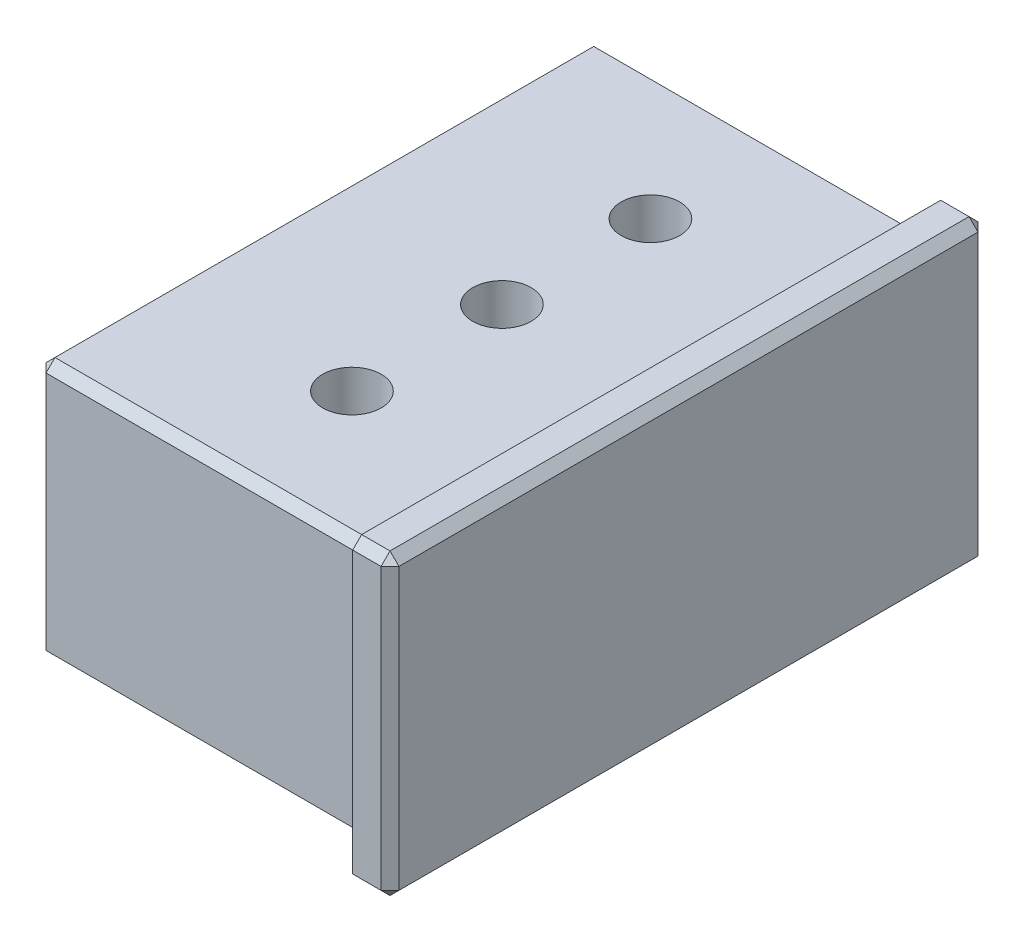
ISO-10303-21;
HEADER;
FILE_DESCRIPTION(('STEP AP214'),'2;1');
FILE_NAME('part.step','',(''),(''),'','','');
FILE_SCHEMA(('AUTOMOTIVE_DESIGN { 1 0 10303 214 1 1 1 1 }'));
ENDSEC;
DATA;
#1=APPLICATION_CONTEXT('core data for automotive mechanical design processes');
#2=APPLICATION_PROTOCOL_DEFINITION('international standard','automotive_design',2000,#1);
#3=PRODUCT_CONTEXT('',#1,'mechanical');
#4=PRODUCT('Part','Part','',(#3));
#5=PRODUCT_RELATED_PRODUCT_CATEGORY('part','',(#4));
#6=PRODUCT_DEFINITION_FORMATION('','',#4);
#7=PRODUCT_DEFINITION_CONTEXT('part definition',#1,'design');
#8=PRODUCT_DEFINITION('design','',#6,#7);
#9=PRODUCT_DEFINITION_SHAPE('','',#8);
#10=(LENGTH_UNIT() NAMED_UNIT(*) SI_UNIT(.MILLI.,.METRE.));
#11=(NAMED_UNIT(*) PLANE_ANGLE_UNIT() SI_UNIT($,.RADIAN.));
#12=(NAMED_UNIT(*) SI_UNIT($,.STERADIAN.) SOLID_ANGLE_UNIT());
#13=UNCERTAINTY_MEASURE_WITH_UNIT(LENGTH_MEASURE(1.E-05),#10,'distance_accuracy_value','');
#14=(GEOMETRIC_REPRESENTATION_CONTEXT(3) GLOBAL_UNCERTAINTY_ASSIGNED_CONTEXT((#13)) GLOBAL_UNIT_ASSIGNED_CONTEXT((#10,
#11,#12)) REPRESENTATION_CONTEXT('',''));
#15=CARTESIAN_POINT('',(0.,0.,0.));
#16=DIRECTION('',(0.,0.,1.));
#17=DIRECTION('',(1.,0.,0.));
#18=AXIS2_PLACEMENT_3D('',#15,#16,#17);
#19=CARTESIAN_POINT('',(28.575,0.,0.));
#20=DIRECTION('',(0.,0.,-1.));
#21=DIRECTION('',(-1.,0.,0.));
#22=AXIS2_PLACEMENT_3D('',#19,#20,#21);
#23=PLANE('',#22);
#24=DIRECTION('',(0.,-1.,0.));
#25=VECTOR('',#24,1.);
#26=CARTESIAN_POINT('',(28.575,0.,0.));
#27=LINE('',#26,#25);
#28=CARTESIAN_POINT('',(28.575,21.209,0.));
#29=VERTEX_POINT('',#28);
#30=CARTESIAN_POINT('',(28.575,0.761999999999998,0.));
#31=VERTEX_POINT('',#30);
#32=EDGE_CURVE('E364',#29,#31,#27,.T.);
#33=ORIENTED_EDGE('',*,*,#32,.F.);
#34=DIRECTION('',(-1.,0.,0.));
#35=VECTOR('',#34,1.);
#36=CARTESIAN_POINT('',(28.575,21.209,0.));
#37=LINE('',#36,#35);
#38=CARTESIAN_POINT('',(0.761999999999999,21.209,0.));
#39=VERTEX_POINT('',#38);
#40=EDGE_CURVE('E59',#29,#39,#37,.T.);
#41=ORIENTED_EDGE('',*,*,#40,.T.);
#42=DIRECTION('',(0.,-1.,0.));
#43=VECTOR('',#42,1.);
#44=CARTESIAN_POINT('',(0.761999999999999,0.,0.));
#45=LINE('',#44,#43);
#46=CARTESIAN_POINT('',(0.761999999999999,0.761999999999999,0.));
#47=VERTEX_POINT('',#46);
#48=EDGE_CURVE('E64',#39,#47,#45,.T.);
#49=ORIENTED_EDGE('',*,*,#48,.T.);
#50=DIRECTION('',(1.,0.,0.));
#51=VECTOR('',#50,1.);
#52=CARTESIAN_POINT('',(28.575,0.761999999999999,0.));
#53=LINE('',#52,#51);
#54=EDGE_CURVE('E279',#47,#31,#53,.T.);
#55=ORIENTED_EDGE('',*,*,#54,.T.);
#56=EDGE_LOOP('',(#33,#41,#49,#55));
#57=FACE_BOUND('',#56,.T.);
#58=ADVANCED_FACE('F41',(#57),#23,.F.);
#59=CARTESIAN_POINT('',(28.575,0.,0.));
#60=DIRECTION('',(0.,1.,0.));
#61=DIRECTION('',(0.,0.,1.));
#62=AXIS2_PLACEMENT_3D('',#59,#60,#61);
#63=PLANE('',#62);
#64=CARTESIAN_POINT('',(15.8750000000001,0.,-10.922));
#65=DIRECTION('',(0.,1.,0.));
#66=DIRECTION('',(0.,0.,1.));
#67=AXIS2_PLACEMENT_3D('',#64,#65,#66);
#68=CIRCLE('',#67,2.4892);
#69=CARTESIAN_POINT('',(15.8750000000001,0.,-8.43280000000003));
#70=VERTEX_POINT('',#69);
#71=EDGE_CURVE('E315',#70,#70,#68,.T.);
#72=ORIENTED_EDGE('',*,*,#71,.T.);
#73=EDGE_LOOP('',(#72));
#74=FACE_BOUND('',#73,.T.);
#75=CARTESIAN_POINT('',(15.8750000000001,0.,-36.322));
#76=DIRECTION('',(0.,1.,0.));
#77=DIRECTION('',(0.,0.,1.));
#78=AXIS2_PLACEMENT_3D('',#75,#76,#77);
#79=CIRCLE('',#78,2.4892);
#80=CARTESIAN_POINT('',(15.8750000000001,0.,-33.8328));
#81=VERTEX_POINT('',#80);
#82=EDGE_CURVE('E648',#81,#81,#79,.T.);
#83=ORIENTED_EDGE('',*,*,#82,.T.);
#84=EDGE_LOOP('',(#83));
#85=FACE_BOUND('',#84,.T.);
#86=CARTESIAN_POINT('',(15.8749999999999,0.,-23.6855000000004));
#87=DIRECTION('',(0.,1.,0.));
#88=DIRECTION('',(0.,0.,1.));
#89=AXIS2_PLACEMENT_3D('',#86,#87,#88);
#90=CIRCLE('',#89,2.4892);
#91=CARTESIAN_POINT('',(15.8749999999999,0.,-21.1963000000004));
#92=VERTEX_POINT('',#91);
#93=EDGE_CURVE('E650',#92,#92,#90,.T.);
#94=ORIENTED_EDGE('',*,*,#93,.T.);
#95=EDGE_LOOP('',(#94));
#96=FACE_BOUND('',#95,.T.);
#97=DIRECTION('',(0.,0.,-1.));
#98=VECTOR('',#97,1.);
#99=CARTESIAN_POINT('',(0.761999999999999,0.,-47.371));
#100=LINE('',#99,#98);
#101=CARTESIAN_POINT('',(0.761999999999999,0.,-0.761999999999999));
#102=VERTEX_POINT('',#101);
#103=CARTESIAN_POINT('',(0.761999999999999,0.,-46.609));
#104=VERTEX_POINT('',#103);
#105=EDGE_CURVE('E253',#102,#104,#100,.T.);
#106=ORIENTED_EDGE('',*,*,#105,.T.);
#107=DIRECTION('',(1.,0.,0.));
#108=VECTOR('',#107,1.);
#109=CARTESIAN_POINT('',(28.575,0.,-46.609));
#110=LINE('',#109,#108);
#111=CARTESIAN_POINT('',(28.575,0.,-46.609));
#112=VERTEX_POINT('',#111);
#113=EDGE_CURVE('E256',#104,#112,#110,.T.);
#114=ORIENTED_EDGE('',*,*,#113,.T.);
#115=DIRECTION('',(0.,0.,-1.));
#116=VECTOR('',#115,1.);
#117=CARTESIAN_POINT('',(28.575,0.,0.));
#118=LINE('',#117,#116);
#119=CARTESIAN_POINT('',(28.575,0.,-0.761999999999999));
#120=VERTEX_POINT('',#119);
#121=EDGE_CURVE('E372',#120,#112,#118,.T.);
#122=ORIENTED_EDGE('',*,*,#121,.F.);
#123=DIRECTION('',(-1.,0.,0.));
#124=VECTOR('',#123,1.);
#125=CARTESIAN_POINT('',(28.575,0.,-0.761999999999999));
#126=LINE('',#125,#124);
#127=EDGE_CURVE('E251',#120,#102,#126,.T.);
#128=ORIENTED_EDGE('',*,*,#127,.T.);
#129=EDGE_LOOP('',(#106,#114,#122,#128));
#130=FACE_BOUND('',#129,.T.);
#131=ADVANCED_FACE('F453',(#74,#85,#96,#130),#63,.F.);
#132=CARTESIAN_POINT('',(28.575,0.,-47.371));
#133=DIRECTION('',(0.,0.,1.));
#134=DIRECTION('',(1.,0.,0.));
#135=AXIS2_PLACEMENT_3D('',#132,#133,#134);
#136=PLANE('',#135);
#137=DIRECTION('',(0.,1.,0.));
#138=VECTOR('',#137,1.);
#139=CARTESIAN_POINT('',(28.575,0.,-47.371));
#140=LINE('',#139,#138);
#141=CARTESIAN_POINT('',(28.575,0.761999999999999,-47.371));
#142=VERTEX_POINT('',#141);
#143=CARTESIAN_POINT('',(28.575,21.209,-47.371));
#144=VERTEX_POINT('',#143);
#145=EDGE_CURVE('E375',#142,#144,#140,.T.);
#146=ORIENTED_EDGE('',*,*,#145,.F.);
#147=DIRECTION('',(-1.,0.,0.));
#148=VECTOR('',#147,1.);
#149=CARTESIAN_POINT('',(28.575,0.761999999999999,-47.371));
#150=LINE('',#149,#148);
#151=CARTESIAN_POINT('',(0.761999999999999,0.761999999999999,-47.371));
#152=VERTEX_POINT('',#151);
#153=EDGE_CURVE('E271',#142,#152,#150,.T.);
#154=ORIENTED_EDGE('',*,*,#153,.T.);
#155=DIRECTION('',(0.,1.,0.));
#156=VECTOR('',#155,1.);
#157=CARTESIAN_POINT('',(0.761999999999999,21.971,-47.371));
#158=LINE('',#157,#156);
#159=CARTESIAN_POINT('',(0.761999999999999,21.209,-47.371));
#160=VERTEX_POINT('',#159);
#161=EDGE_CURVE('E269',#152,#160,#158,.T.);
#162=ORIENTED_EDGE('',*,*,#161,.T.);
#163=DIRECTION('',(1.,0.,0.));
#164=VECTOR('',#163,1.);
#165=CARTESIAN_POINT('',(28.575,21.209,-47.371));
#166=LINE('',#165,#164);
#167=EDGE_CURVE('E267',#160,#144,#166,.T.);
#168=ORIENTED_EDGE('',*,*,#167,.T.);
#169=EDGE_LOOP('',(#146,#154,#162,#168));
#170=FACE_BOUND('',#169,.T.);
#171=ADVANCED_FACE('F458',(#170),#136,.F.);
#172=CARTESIAN_POINT('',(28.575,21.971,0.));
#173=DIRECTION('',(0.,-1.,0.));
#174=DIRECTION('',(0.,0.,-1.));
#175=AXIS2_PLACEMENT_3D('',#172,#173,#174);
#176=PLANE('',#175);
#177=CARTESIAN_POINT('',(15.8750000000001,21.971,-10.922));
#178=DIRECTION('',(0.,1.,0.));
#179=DIRECTION('',(0.,0.,1.));
#180=AXIS2_PLACEMENT_3D('',#177,#178,#179);
#181=CIRCLE('',#180,2.4892);
#182=CARTESIAN_POINT('',(15.8750000000001,21.971,-8.43280000000003));
#183=VERTEX_POINT('',#182);
#184=EDGE_CURVE('E658',#183,#183,#181,.T.);
#185=ORIENTED_EDGE('',*,*,#184,.F.);
#186=EDGE_LOOP('',(#185));
#187=FACE_BOUND('',#186,.T.);
#188=CARTESIAN_POINT('',(15.8750000000001,21.971,-36.322));
#189=DIRECTION('',(0.,1.,0.));
#190=DIRECTION('',(0.,0.,1.));
#191=AXIS2_PLACEMENT_3D('',#188,#189,#190);
#192=CIRCLE('',#191,2.4892);
#193=CARTESIAN_POINT('',(15.8750000000001,21.971,-33.8328));
#194=VERTEX_POINT('',#193);
#195=EDGE_CURVE('E645',#194,#194,#192,.T.);
#196=ORIENTED_EDGE('',*,*,#195,.F.);
#197=EDGE_LOOP('',(#196));
#198=FACE_BOUND('',#197,.T.);
#199=CARTESIAN_POINT('',(15.8749999999999,21.971,-23.6855000000004));
#200=DIRECTION('',(0.,1.,0.));
#201=DIRECTION('',(0.,0.,1.));
#202=AXIS2_PLACEMENT_3D('',#199,#200,#201);
#203=CIRCLE('',#202,2.4892);
#204=CARTESIAN_POINT('',(15.8749999999999,21.971,-21.1963000000004));
#205=VERTEX_POINT('',#204);
#206=EDGE_CURVE('E653',#205,#205,#203,.T.);
#207=ORIENTED_EDGE('',*,*,#206,.F.);
#208=EDGE_LOOP('',(#207));
#209=FACE_BOUND('',#208,.T.);
#210=DIRECTION('',(0.,0.,1.));
#211=VECTOR('',#210,1.);
#212=CARTESIAN_POINT('',(28.575,21.971,0.));
#213=LINE('',#212,#211);
#214=CARTESIAN_POINT('',(28.575,21.971,-46.609));
#215=VERTEX_POINT('',#214);
#216=CARTESIAN_POINT('',(28.575,21.971,-0.761999999999999));
#217=VERTEX_POINT('',#216);
#218=EDGE_CURVE('E210',#215,#217,#213,.T.);
#219=ORIENTED_EDGE('',*,*,#218,.F.);
#220=DIRECTION('',(-1.,0.,0.));
#221=VECTOR('',#220,1.);
#222=CARTESIAN_POINT('',(28.575,21.971,-46.609));
#223=LINE('',#222,#221);
#224=CARTESIAN_POINT('',(0.761999999999999,21.971,-46.609));
#225=VERTEX_POINT('',#224);
#226=EDGE_CURVE('E277',#215,#225,#223,.T.);
#227=ORIENTED_EDGE('',*,*,#226,.T.);
#228=DIRECTION('',(0.,0.,1.));
#229=VECTOR('',#228,1.);
#230=CARTESIAN_POINT('',(0.761999999999999,21.971,0.));
#231=LINE('',#230,#229);
#232=CARTESIAN_POINT('',(0.761999999999999,21.971,-0.761999999999999));
#233=VERTEX_POINT('',#232);
#234=EDGE_CURVE('E275',#225,#233,#231,.T.);
#235=ORIENTED_EDGE('',*,*,#234,.T.);
#236=DIRECTION('',(1.,0.,0.));
#237=VECTOR('',#236,1.);
#238=CARTESIAN_POINT('',(28.575,21.971,-0.761999999999999));
#239=LINE('',#238,#237);
#240=EDGE_CURVE('E273',#233,#217,#239,.T.);
#241=ORIENTED_EDGE('',*,*,#240,.T.);
#242=EDGE_LOOP('',(#219,#227,#235,#241));
#243=FACE_BOUND('',#242,.T.);
#244=ADVANCED_FACE('F592',(#187,#198,#209,#243),#176,.F.);
#245=CARTESIAN_POINT('',(0.,0.,0.));
#246=DIRECTION('',(-1.,0.,0.));
#247=DIRECTION('',(0.,0.,1.));
#248=AXIS2_PLACEMENT_3D('',#245,#246,#247);
#249=PLANE('',#248);
#250=DIRECTION('',(0.,-1.,0.));
#251=VECTOR('',#250,1.);
#252=CARTESIAN_POINT('',(0.,0.,-46.609));
#253=LINE('',#252,#251);
#254=CARTESIAN_POINT('',(0.,21.209,-46.609));
#255=VERTEX_POINT('',#254);
#256=CARTESIAN_POINT('',(0.,0.761999999999999,-46.609));
#257=VERTEX_POINT('',#256);
#258=EDGE_CURVE('E262',#255,#257,#253,.T.);
#259=ORIENTED_EDGE('',*,*,#258,.T.);
#260=DIRECTION('',(0.,0.,1.));
#261=VECTOR('',#260,1.);
#262=CARTESIAN_POINT('',(0.,0.761999999999999,0.));
#263=LINE('',#262,#261);
#264=CARTESIAN_POINT('',(0.,0.761999999999999,-0.761999999999999));
#265=VERTEX_POINT('',#264);
#266=EDGE_CURVE('E264',#257,#265,#263,.T.);
#267=ORIENTED_EDGE('',*,*,#266,.T.);
#268=DIRECTION('',(0.,1.,0.));
#269=VECTOR('',#268,1.);
#270=CARTESIAN_POINT('',(0.,21.971,-0.761999999999999));
#271=LINE('',#270,#269);
#272=CARTESIAN_POINT('',(0.,21.209,-0.761999999999999));
#273=VERTEX_POINT('',#272);
#274=EDGE_CURVE('E258',#265,#273,#271,.T.);
#275=ORIENTED_EDGE('',*,*,#274,.T.);
#276=DIRECTION('',(0.,0.,-1.));
#277=VECTOR('',#276,1.);
#278=CARTESIAN_POINT('',(0.,21.209,-47.371));
#279=LINE('',#278,#277);
#280=EDGE_CURVE('E260',#273,#255,#279,.T.);
#281=ORIENTED_EDGE('',*,*,#280,.T.);
#282=EDGE_LOOP('',(#259,#267,#275,#281));
#283=FACE_BOUND('',#282,.T.);
#284=ADVANCED_FACE('F601',(#283),#249,.T.);
#285=CARTESIAN_POINT('',(28.575,0.,0.));
#286=DIRECTION('',(1.,0.,0.));
#287=DIRECTION('',(0.,0.,-1.));
#288=AXIS2_PLACEMENT_3D('',#285,#286,#287);
#289=PLANE('',#288);
#290=DIRECTION('',(0.,0.,1.));
#291=VECTOR('',#290,1.);
#292=CARTESIAN_POINT('',(28.575,23.6855,-49.0855));
#293=LINE('',#292,#291);
#294=CARTESIAN_POINT('',(28.575,23.6855,-48.3235));
#295=VERTEX_POINT('',#294);
#296=CARTESIAN_POINT('',(28.575,23.6855,0.952500000000002));
#297=VERTEX_POINT('',#296);
#298=EDGE_CURVE('E373',#295,#297,#293,.T.);
#299=ORIENTED_EDGE('',*,*,#298,.F.);
#300=DIRECTION('',(0.,0.707106781186548,0.707106781186548));
#301=VECTOR('',#300,1.);
#302=CARTESIAN_POINT('',(28.575,23.6855,-48.3235));
#303=LINE('',#302,#301);
#304=CARTESIAN_POINT('',(28.575,22.9235,-49.0855));
#305=VERTEX_POINT('',#304);
#306=EDGE_CURVE('E231',#295,#305,#303,.F.);
#307=ORIENTED_EDGE('',*,*,#306,.T.);
#308=DIRECTION('',(0.,1.,0.));
#309=VECTOR('',#308,1.);
#310=CARTESIAN_POINT('',(28.575,-1.7145,-49.0855));
#311=LINE('',#310,#309);
#312=CARTESIAN_POINT('',(28.575,-0.952500000000002,-49.0855));
#313=VERTEX_POINT('',#312);
#314=EDGE_CURVE('E378',#313,#305,#311,.T.);
#315=ORIENTED_EDGE('',*,*,#314,.F.);
#316=DIRECTION('',(0.,0.707106781186548,-0.707106781186548));
#317=VECTOR('',#316,1.);
#318=CARTESIAN_POINT('',(28.575,-0.952500000000002,-49.0855));
#319=LINE('',#318,#317);
#320=CARTESIAN_POINT('',(28.575,-1.7145,-48.3235));
#321=VERTEX_POINT('',#320);
#322=EDGE_CURVE('E229',#313,#321,#319,.F.);
#323=ORIENTED_EDGE('',*,*,#322,.T.);
#324=DIRECTION('',(0.,0.,-1.));
#325=VECTOR('',#324,1.);
#326=CARTESIAN_POINT('',(28.575,-1.7145,-49.0855));
#327=LINE('',#326,#325);
#328=CARTESIAN_POINT('',(28.575,-1.7145,0.952500000000002));
#329=VERTEX_POINT('',#328);
#330=EDGE_CURVE('E420',#329,#321,#327,.T.);
#331=ORIENTED_EDGE('',*,*,#330,.F.);
#332=DIRECTION('',(0.,-0.707106781186548,-0.707106781186548));
#333=VECTOR('',#332,1.);
#334=CARTESIAN_POINT('',(28.575,-1.7145,0.952500000000002));
#335=LINE('',#334,#333);
#336=CARTESIAN_POINT('',(28.575,-0.952500000000002,1.7145));
#337=VERTEX_POINT('',#336);
#338=EDGE_CURVE('E227',#329,#337,#335,.F.);
#339=ORIENTED_EDGE('',*,*,#338,.T.);
#340=DIRECTION('',(0.,-1.,0.));
#341=VECTOR('',#340,1.);
#342=CARTESIAN_POINT('',(28.575,-1.7145,1.7145));
#343=LINE('',#342,#341);
#344=CARTESIAN_POINT('',(28.575,22.9235,1.7145));
#345=VERTEX_POINT('',#344);
#346=EDGE_CURVE('E311',#345,#337,#343,.T.);
#347=ORIENTED_EDGE('',*,*,#346,.F.);
#348=DIRECTION('',(0.,-0.707106781186548,0.707106781186548));
#349=VECTOR('',#348,1.);
#350=CARTESIAN_POINT('',(28.575,22.9235,1.7145));
#351=LINE('',#350,#349);
#352=EDGE_CURVE('E225',#345,#297,#351,.F.);
#353=ORIENTED_EDGE('',*,*,#352,.T.);
#354=EDGE_LOOP('',(#299,#307,#315,#323,#331,#339,#347,#353));
#355=FACE_BOUND('',#354,.T.);
#356=ORIENTED_EDGE('',*,*,#145,.T.);
#357=DIRECTION('',(0.,-0.707106781186548,-0.707106781186548));
#358=VECTOR('',#357,1.);
#359=CARTESIAN_POINT('',(28.575,34.29,-34.29));
#360=LINE('',#359,#358);
#361=EDGE_CURVE('E285',#144,#215,#360,.F.);
#362=ORIENTED_EDGE('',*,*,#361,.T.);
#363=ORIENTED_EDGE('',*,*,#218,.T.);
#364=DIRECTION('',(0.,0.707106781186548,-0.707106781186548));
#365=VECTOR('',#364,1.);
#366=CARTESIAN_POINT('',(28.575,10.6045,10.6045));
#367=LINE('',#366,#365);
#368=EDGE_CURVE('E51',#217,#29,#367,.F.);
#369=ORIENTED_EDGE('',*,*,#368,.T.);
#370=ORIENTED_EDGE('',*,*,#32,.T.);
#371=DIRECTION('',(0.,0.707106781186548,0.707106781186548));
#372=VECTOR('',#371,1.);
#373=CARTESIAN_POINT('',(28.575,0.380999999999999,-0.380999999999999));
#374=LINE('',#373,#372);
#375=EDGE_CURVE('E11',#31,#120,#374,.F.);
#376=ORIENTED_EDGE('',*,*,#375,.T.);
#377=ORIENTED_EDGE('',*,*,#121,.T.);
#378=DIRECTION('',(0.,-0.707106781186548,0.707106781186548));
#379=VECTOR('',#378,1.);
#380=CARTESIAN_POINT('',(28.575,-23.3045,-23.3045));
#381=LINE('',#380,#379);
#382=EDGE_CURVE('E283',#112,#142,#381,.F.);
#383=ORIENTED_EDGE('',*,*,#382,.T.);
#384=EDGE_LOOP('',(#356,#362,#363,#369,#370,#376,#377,#383));
#385=FACE_BOUND('',#384,.T.);
#386=ADVANCED_FACE('F367',(#355,#385),#289,.F.);
#387=CARTESIAN_POINT('',(31.75,-1.7145,1.7145));
#388=DIRECTION('',(0.,0.,-1.));
#389=DIRECTION('',(-1.,0.,0.));
#390=AXIS2_PLACEMENT_3D('',#387,#388,#389);
#391=PLANE('',#390);
#392=ORIENTED_EDGE('',*,*,#346,.T.);
#393=DIRECTION('',(1.,0.,0.));
#394=VECTOR('',#393,1.);
#395=CARTESIAN_POINT('',(31.75,-0.952500000000002,1.7145));
#396=LINE('',#395,#394);
#397=CARTESIAN_POINT('',(30.988,-0.952500000000002,1.7145));
#398=VERTEX_POINT('',#397);
#399=EDGE_CURVE('E249',#337,#398,#396,.T.);
#400=ORIENTED_EDGE('',*,*,#399,.T.);
#401=DIRECTION('',(0.,1.,0.));
#402=VECTOR('',#401,1.);
#403=CARTESIAN_POINT('',(30.988,23.6855,1.7145));
#404=LINE('',#403,#402);
#405=CARTESIAN_POINT('',(30.988,22.9235,1.7145));
#406=VERTEX_POINT('',#405);
#407=EDGE_CURVE('E247',#398,#406,#404,.T.);
#408=ORIENTED_EDGE('',*,*,#407,.T.);
#409=DIRECTION('',(-1.,0.,0.));
#410=VECTOR('',#409,1.);
#411=CARTESIAN_POINT('',(31.75,22.9235,1.7145));
#412=LINE('',#411,#410);
#413=EDGE_CURVE('E245',#406,#345,#412,.T.);
#414=ORIENTED_EDGE('',*,*,#413,.T.);
#415=EDGE_LOOP('',(#392,#400,#408,#414));
#416=FACE_BOUND('',#415,.T.);
#417=ADVANCED_FACE('F415',(#416),#391,.F.);
#418=CARTESIAN_POINT('',(31.75,-1.7145,-49.0855));
#419=DIRECTION('',(0.,1.,0.));
#420=DIRECTION('',(0.,0.,1.));
#421=AXIS2_PLACEMENT_3D('',#418,#419,#420);
#422=PLANE('',#421);
#423=ORIENTED_EDGE('',*,*,#330,.T.);
#424=DIRECTION('',(1.,0.,0.));
#425=VECTOR('',#424,1.);
#426=CARTESIAN_POINT('',(31.75,-1.7145,-48.3235));
#427=LINE('',#426,#425);
#428=CARTESIAN_POINT('',(30.988,-1.7145,-48.3235));
#429=VERTEX_POINT('',#428);
#430=EDGE_CURVE('E243',#321,#429,#427,.T.);
#431=ORIENTED_EDGE('',*,*,#430,.T.);
#432=DIRECTION('',(0.,0.,1.));
#433=VECTOR('',#432,1.);
#434=CARTESIAN_POINT('',(30.988,-1.7145,1.7145));
#435=LINE('',#434,#433);
#436=CARTESIAN_POINT('',(30.988,-1.7145,0.952500000000002));
#437=VERTEX_POINT('',#436);
#438=EDGE_CURVE('E241',#429,#437,#435,.T.);
#439=ORIENTED_EDGE('',*,*,#438,.T.);
#440=DIRECTION('',(-1.,0.,0.));
#441=VECTOR('',#440,1.);
#442=CARTESIAN_POINT('',(31.75,-1.7145,0.952500000000002));
#443=LINE('',#442,#441);
#444=EDGE_CURVE('E239',#437,#329,#443,.T.);
#445=ORIENTED_EDGE('',*,*,#444,.T.);
#446=EDGE_LOOP('',(#423,#431,#439,#445));
#447=FACE_BOUND('',#446,.T.);
#448=ADVANCED_FACE('F436',(#447),#422,.F.);
#449=CARTESIAN_POINT('',(31.75,-1.7145,-49.0855));
#450=DIRECTION('',(0.,0.,1.));
#451=DIRECTION('',(1.,0.,0.));
#452=AXIS2_PLACEMENT_3D('',#449,#450,#451);
#453=PLANE('',#452);
#454=ORIENTED_EDGE('',*,*,#314,.T.);
#455=DIRECTION('',(1.,0.,0.));
#456=VECTOR('',#455,1.);
#457=CARTESIAN_POINT('',(31.75,22.9235,-49.0855));
#458=LINE('',#457,#456);
#459=CARTESIAN_POINT('',(30.988,22.9235,-49.0855));
#460=VERTEX_POINT('',#459);
#461=EDGE_CURVE('E237',#305,#460,#458,.T.);
#462=ORIENTED_EDGE('',*,*,#461,.T.);
#463=DIRECTION('',(0.,-1.,0.));
#464=VECTOR('',#463,1.);
#465=CARTESIAN_POINT('',(30.988,-1.7145,-49.0855));
#466=LINE('',#465,#464);
#467=CARTESIAN_POINT('',(30.988,-0.952500000000002,-49.0855));
#468=VERTEX_POINT('',#467);
#469=EDGE_CURVE('E235',#460,#468,#466,.T.);
#470=ORIENTED_EDGE('',*,*,#469,.T.);
#471=DIRECTION('',(-1.,0.,0.));
#472=VECTOR('',#471,1.);
#473=CARTESIAN_POINT('',(31.75,-0.952500000000002,-49.0855));
#474=LINE('',#473,#472);
#475=EDGE_CURVE('E233',#468,#313,#474,.T.);
#476=ORIENTED_EDGE('',*,*,#475,.T.);
#477=EDGE_LOOP('',(#454,#462,#470,#476));
#478=FACE_BOUND('',#477,.T.);
#479=ADVANCED_FACE('F429',(#478),#453,.F.);
#480=CARTESIAN_POINT('',(31.75,23.6855,-49.0855));
#481=DIRECTION('',(0.,-1.,0.));
#482=DIRECTION('',(0.,0.,-1.));
#483=AXIS2_PLACEMENT_3D('',#480,#481,#482);
#484=PLANE('',#483);
#485=DIRECTION('',(0.,0.,-1.));
#486=VECTOR('',#485,1.);
#487=CARTESIAN_POINT('',(30.988,23.6855,-49.0855));
#488=LINE('',#487,#486);
#489=CARTESIAN_POINT('',(30.988,23.6855,0.952500000000002));
#490=VERTEX_POINT('',#489);
#491=CARTESIAN_POINT('',(30.988,23.6855,-48.3235));
#492=VERTEX_POINT('',#491);
#493=EDGE_CURVE('E187',#490,#492,#488,.T.);
#494=ORIENTED_EDGE('',*,*,#493,.T.);
#495=DIRECTION('',(-1.,0.,0.));
#496=VECTOR('',#495,1.);
#497=CARTESIAN_POINT('',(31.75,23.6855,-48.3235));
#498=LINE('',#497,#496);
#499=EDGE_CURVE('E223',#492,#295,#498,.T.);
#500=ORIENTED_EDGE('',*,*,#499,.T.);
#501=ORIENTED_EDGE('',*,*,#298,.T.);
#502=DIRECTION('',(1.,0.,0.));
#503=VECTOR('',#502,1.);
#504=CARTESIAN_POINT('',(31.75,23.6855,0.952500000000002));
#505=LINE('',#504,#503);
#506=EDGE_CURVE('E216',#297,#490,#505,.T.);
#507=ORIENTED_EDGE('',*,*,#506,.T.);
#508=EDGE_LOOP('',(#494,#500,#501,#507));
#509=FACE_BOUND('',#508,.T.);
#510=ADVANCED_FACE('F406',(#509),#484,.F.);
#511=CARTESIAN_POINT('',(31.75,0.,0.));
#512=DIRECTION('',(1.,0.,0.));
#513=DIRECTION('',(0.,0.,-1.));
#514=AXIS2_PLACEMENT_3D('',#511,#512,#513);
#515=PLANE('',#514);
#516=DIRECTION('',(0.,1.,0.));
#517=VECTOR('',#516,1.);
#518=CARTESIAN_POINT('',(31.75,23.6855,-48.3235));
#519=LINE('',#518,#517);
#520=CARTESIAN_POINT('',(31.75,-0.952500000000002,-48.3235));
#521=VERTEX_POINT('',#520);
#522=CARTESIAN_POINT('',(31.75,22.9235,-48.3235));
#523=VERTEX_POINT('',#522);
#524=EDGE_CURVE('E214',#521,#523,#519,.T.);
#525=ORIENTED_EDGE('',*,*,#524,.T.);
#526=DIRECTION('',(0.,0.,1.));
#527=VECTOR('',#526,1.);
#528=CARTESIAN_POINT('',(31.75,22.9235,1.7145));
#529=LINE('',#528,#527);
#530=CARTESIAN_POINT('',(31.75,22.9235,0.952500000000002));
#531=VERTEX_POINT('',#530);
#532=EDGE_CURVE('E185',#523,#531,#529,.T.);
#533=ORIENTED_EDGE('',*,*,#532,.T.);
#534=DIRECTION('',(0.,-1.,0.));
#535=VECTOR('',#534,1.);
#536=CARTESIAN_POINT('',(31.75,-1.7145,0.952500000000002));
#537=LINE('',#536,#535);
#538=CARTESIAN_POINT('',(31.75,-0.952500000000002,0.952500000000002));
#539=VERTEX_POINT('',#538);
#540=EDGE_CURVE('E203',#531,#539,#537,.T.);
#541=ORIENTED_EDGE('',*,*,#540,.T.);
#542=DIRECTION('',(0.,0.,-1.));
#543=VECTOR('',#542,1.);
#544=CARTESIAN_POINT('',(31.75,-0.952500000000002,-49.0855));
#545=LINE('',#544,#543);
#546=EDGE_CURVE('E209',#539,#521,#545,.T.);
#547=ORIENTED_EDGE('',*,*,#546,.T.);
#548=EDGE_LOOP('',(#525,#533,#541,#547));
#549=FACE_BOUND('',#548,.T.);
#550=ADVANCED_FACE('F212',(#549),#515,.T.);
#551=CARTESIAN_POINT('',(31.75,-0.952500000000002,-49.0855));
#552=DIRECTION('',(0.,0.707106781186548,0.707106781186548));
#553=DIRECTION('',(-1.,0.,0.));
#554=AXIS2_PLACEMENT_3D('',#551,#552,#553);
#555=PLANE('',#554);
#556=ORIENTED_EDGE('',*,*,#322,.F.);
#557=ORIENTED_EDGE('',*,*,#475,.F.);
#558=DIRECTION('',(0.,-0.707106781186547,0.707106781186547));
#559=VECTOR('',#558,1.);
#560=CARTESIAN_POINT('',(30.988,-0.952500000000002,-49.0855));
#561=LINE('',#560,#559);
#562=EDGE_CURVE('E308',#429,#468,#561,.F.);
#563=ORIENTED_EDGE('',*,*,#562,.F.);
#564=ORIENTED_EDGE('',*,*,#430,.F.);
#565=EDGE_LOOP('',(#556,#557,#563,#564));
#566=FACE_BOUND('',#565,.T.);
#567=ADVANCED_FACE('F434',(#566),#555,.F.);
#568=CARTESIAN_POINT('',(31.75,-0.952500000000002,0.));
#569=DIRECTION('',(0.707106781186548,-0.707106781186548,0.));
#570=DIRECTION('',(0.,0.,1.));
#571=AXIS2_PLACEMENT_3D('',#568,#569,#570);
#572=PLANE('',#571);
#573=DIRECTION('',(0.707106781186548,0.707106781186548,0.));
#574=VECTOR('',#573,1.);
#575=CARTESIAN_POINT('',(30.988,-1.7145,0.952500000000002));
#576=LINE('',#575,#574);
#577=EDGE_CURVE('E302',#437,#539,#576,.T.);
#578=ORIENTED_EDGE('',*,*,#577,.F.);
#579=ORIENTED_EDGE('',*,*,#438,.F.);
#580=DIRECTION('',(-0.707106781186547,-0.707106781186547,0.));
#581=VECTOR('',#580,1.);
#582=CARTESIAN_POINT('',(31.369,-1.3335,-48.3235));
#583=LINE('',#582,#581);
#584=EDGE_CURVE('E305',#521,#429,#583,.T.);
#585=ORIENTED_EDGE('',*,*,#584,.F.);
#586=ORIENTED_EDGE('',*,*,#546,.F.);
#587=EDGE_LOOP('',(#578,#579,#585,#586));
#588=FACE_BOUND('',#587,.T.);
#589=ADVANCED_FACE('F388',(#588),#572,.T.);
#590=CARTESIAN_POINT('',(31.75,-1.7145,0.952500000000002));
#591=DIRECTION('',(0.,0.707106781186548,-0.707106781186548));
#592=DIRECTION('',(-1.,0.,0.));
#593=AXIS2_PLACEMENT_3D('',#590,#591,#592);
#594=PLANE('',#593);
#595=ORIENTED_EDGE('',*,*,#338,.F.);
#596=ORIENTED_EDGE('',*,*,#444,.F.);
#597=DIRECTION('',(0.,0.707106781186547,0.707106781186547));
#598=VECTOR('',#597,1.);
#599=CARTESIAN_POINT('',(30.988,-1.7145,0.952500000000002));
#600=LINE('',#599,#598);
#601=EDGE_CURVE('E299',#398,#437,#600,.F.);
#602=ORIENTED_EDGE('',*,*,#601,.F.);
#603=ORIENTED_EDGE('',*,*,#399,.F.);
#604=EDGE_LOOP('',(#595,#596,#602,#603));
#605=FACE_BOUND('',#604,.T.);
#606=ADVANCED_FACE('F439',(#605),#594,.F.);
#607=CARTESIAN_POINT('',(30.988,-0.952500000000002,-49.0855));
#608=DIRECTION('',(0.577350269189626,-0.577350269189626,-0.577350269189626));
#609=DIRECTION('',(-0.707106781186548,0.,-0.707106781186548));
#610=AXIS2_PLACEMENT_3D('',#607,#608,#609);
#611=PLANE('',#610);
#612=ORIENTED_EDGE('',*,*,#584,.T.);
#613=ORIENTED_EDGE('',*,*,#562,.T.);
#614=DIRECTION('',(0.707106781186547,0.,0.707106781186547));
#615=VECTOR('',#614,1.);
#616=CARTESIAN_POINT('',(30.988,-0.952500000000002,-49.0855));
#617=LINE('',#616,#615);
#618=EDGE_CURVE('E296',#521,#468,#617,.F.);
#619=ORIENTED_EDGE('',*,*,#618,.F.);
#620=EDGE_LOOP('',(#612,#613,#619));
#621=FACE_BOUND('',#620,.T.);
#622=ADVANCED_FACE('F391',(#621),#611,.T.);
#623=CARTESIAN_POINT('',(30.988,-1.7145,0.952500000000002));
#624=DIRECTION('',(0.577350269189626,-0.577350269189626,0.577350269189626));
#625=DIRECTION('',(0.707106781186548,0.707106781186548,0.));
#626=AXIS2_PLACEMENT_3D('',#623,#624,#625);
#627=PLANE('',#626);
#628=ORIENTED_EDGE('',*,*,#601,.T.);
#629=ORIENTED_EDGE('',*,*,#577,.T.);
#630=DIRECTION('',(-0.707106781186547,0.,0.707106781186547));
#631=VECTOR('',#630,1.);
#632=CARTESIAN_POINT('',(31.369,-0.952500000000002,1.3335));
#633=LINE('',#632,#631);
#634=EDGE_CURVE('E206',#398,#539,#633,.F.);
#635=ORIENTED_EDGE('',*,*,#634,.F.);
#636=EDGE_LOOP('',(#628,#629,#635));
#637=FACE_BOUND('',#636,.T.);
#638=ADVANCED_FACE('F442',(#637),#627,.T.);
#639=CARTESIAN_POINT('',(31.75,23.6855,-48.3235));
#640=DIRECTION('',(0.,-0.707106781186548,0.707106781186548));
#641=DIRECTION('',(-1.,0.,0.));
#642=AXIS2_PLACEMENT_3D('',#639,#640,#641);
#643=PLANE('',#642);
#644=ORIENTED_EDGE('',*,*,#306,.F.);
#645=ORIENTED_EDGE('',*,*,#499,.F.);
#646=DIRECTION('',(0.,-0.707106781186547,-0.707106781186547));
#647=VECTOR('',#646,1.);
#648=CARTESIAN_POINT('',(30.988,23.6855,-48.3235));
#649=LINE('',#648,#647);
#650=EDGE_CURVE('E292',#460,#492,#649,.F.);
#651=ORIENTED_EDGE('',*,*,#650,.F.);
#652=ORIENTED_EDGE('',*,*,#461,.F.);
#653=EDGE_LOOP('',(#644,#645,#651,#652));
#654=FACE_BOUND('',#653,.T.);
#655=ADVANCED_FACE('F403',(#654),#643,.F.);
#656=CARTESIAN_POINT('',(31.75,0.,-48.3235));
#657=DIRECTION('',(0.707106781186548,0.,-0.707106781186548));
#658=DIRECTION('',(0.,-1.,0.));
#659=AXIS2_PLACEMENT_3D('',#656,#657,#658);
#660=PLANE('',#659);
#661=ORIENTED_EDGE('',*,*,#618,.T.);
#662=ORIENTED_EDGE('',*,*,#469,.F.);
#663=DIRECTION('',(-0.707106781186547,0.,-0.707106781186547));
#664=VECTOR('',#663,1.);
#665=CARTESIAN_POINT('',(31.369,22.9235,-48.7045));
#666=LINE('',#665,#664);
#667=EDGE_CURVE('E200',#523,#460,#666,.T.);
#668=ORIENTED_EDGE('',*,*,#667,.F.);
#669=ORIENTED_EDGE('',*,*,#524,.F.);
#670=EDGE_LOOP('',(#661,#662,#668,#669));
#671=FACE_BOUND('',#670,.T.);
#672=ADVANCED_FACE('F394',(#671),#660,.T.);
#673=CARTESIAN_POINT('',(31.75,0.,0.952500000000002));
#674=DIRECTION('',(0.707106781186548,0.,0.707106781186548));
#675=DIRECTION('',(0.,1.,0.));
#676=AXIS2_PLACEMENT_3D('',#673,#674,#675);
#677=PLANE('',#676);
#678=ORIENTED_EDGE('',*,*,#634,.T.);
#679=ORIENTED_EDGE('',*,*,#540,.F.);
#680=DIRECTION('',(0.707106781186548,0.,-0.707106781186548));
#681=VECTOR('',#680,1.);
#682=CARTESIAN_POINT('',(31.75,22.9235,0.952500000000002));
#683=LINE('',#682,#681);
#684=EDGE_CURVE('E193',#406,#531,#683,.T.);
#685=ORIENTED_EDGE('',*,*,#684,.F.);
#686=ORIENTED_EDGE('',*,*,#407,.F.);
#687=EDGE_LOOP('',(#678,#679,#685,#686));
#688=FACE_BOUND('',#687,.T.);
#689=ADVANCED_FACE('F204',(#688),#677,.T.);
#690=CARTESIAN_POINT('',(31.75,22.9235,1.7145));
#691=DIRECTION('',(0.,-0.707106781186548,-0.707106781186548));
#692=DIRECTION('',(-1.,0.,0.));
#693=AXIS2_PLACEMENT_3D('',#690,#691,#692);
#694=PLANE('',#693);
#695=ORIENTED_EDGE('',*,*,#352,.F.);
#696=ORIENTED_EDGE('',*,*,#413,.F.);
#697=DIRECTION('',(0.,0.707106781186547,-0.707106781186547));
#698=VECTOR('',#697,1.);
#699=CARTESIAN_POINT('',(30.988,23.3045,1.3335));
#700=LINE('',#699,#698);
#701=EDGE_CURVE('E197',#490,#406,#700,.F.);
#702=ORIENTED_EDGE('',*,*,#701,.F.);
#703=ORIENTED_EDGE('',*,*,#506,.F.);
#704=EDGE_LOOP('',(#695,#696,#702,#703));
#705=FACE_BOUND('',#704,.T.);
#706=ADVANCED_FACE('F411',(#705),#694,.F.);
#707=CARTESIAN_POINT('',(30.988,23.6855,-48.3235));
#708=DIRECTION('',(0.577350269189626,0.577350269189626,-0.577350269189626));
#709=DIRECTION('',(-0.707106781186548,0.,-0.707106781186548));
#710=AXIS2_PLACEMENT_3D('',#707,#708,#709);
#711=PLANE('',#710);
#712=ORIENTED_EDGE('',*,*,#667,.T.);
#713=ORIENTED_EDGE('',*,*,#650,.T.);
#714=DIRECTION('',(0.707106781186547,-0.707106781186547,0.));
#715=VECTOR('',#714,1.);
#716=CARTESIAN_POINT('',(30.988,23.6855,-48.3235));
#717=LINE('',#716,#715);
#718=EDGE_CURVE('E190',#523,#492,#717,.F.);
#719=ORIENTED_EDGE('',*,*,#718,.F.);
#720=EDGE_LOOP('',(#712,#713,#719));
#721=FACE_BOUND('',#720,.T.);
#722=ADVANCED_FACE('F398',(#721),#711,.T.);
#723=CARTESIAN_POINT('',(31.75,22.9235,0.952500000000002));
#724=DIRECTION('',(0.577350269189626,0.577350269189626,0.577350269189626));
#725=DIRECTION('',(0.707106781186548,0.,-0.707106781186548));
#726=AXIS2_PLACEMENT_3D('',#723,#724,#725);
#727=PLANE('',#726);
#728=ORIENTED_EDGE('',*,*,#701,.T.);
#729=ORIENTED_EDGE('',*,*,#684,.T.);
#730=DIRECTION('',(-0.707106781186547,0.707106781186547,0.));
#731=VECTOR('',#730,1.);
#732=CARTESIAN_POINT('',(31.75,22.9235,0.952500000000002));
#733=LINE('',#732,#731);
#734=EDGE_CURVE('E181',#490,#531,#733,.F.);
#735=ORIENTED_EDGE('',*,*,#734,.F.);
#736=EDGE_LOOP('',(#728,#729,#735));
#737=FACE_BOUND('',#736,.T.);
#738=ADVANCED_FACE('F195',(#737),#727,.T.);
#739=CARTESIAN_POINT('',(31.75,22.9235,0.));
#740=DIRECTION('',(0.707106781186548,0.707106781186548,0.));
#741=DIRECTION('',(0.,0.,-1.));
#742=AXIS2_PLACEMENT_3D('',#739,#740,#741);
#743=PLANE('',#742);
#744=ORIENTED_EDGE('',*,*,#718,.T.);
#745=ORIENTED_EDGE('',*,*,#493,.F.);
#746=ORIENTED_EDGE('',*,*,#734,.T.);
#747=ORIENTED_EDGE('',*,*,#532,.F.);
#748=EDGE_LOOP('',(#744,#745,#746,#747));
#749=FACE_BOUND('',#748,.T.);
#750=ADVANCED_FACE('F183',(#749),#743,.T.);
#751=CARTESIAN_POINT('',(28.575,21.209,0.));
#752=DIRECTION('',(0.,-0.707106781186548,-0.707106781186548));
#753=DIRECTION('',(-1.,0.,0.));
#754=AXIS2_PLACEMENT_3D('',#751,#752,#753);
#755=PLANE('',#754);
#756=ORIENTED_EDGE('',*,*,#368,.F.);
#757=ORIENTED_EDGE('',*,*,#240,.F.);
#758=DIRECTION('',(0.,-0.707106781186547,0.707106781186547));
#759=VECTOR('',#758,1.);
#760=CARTESIAN_POINT('',(0.761999999999999,21.971,-0.761999999999999));
#761=LINE('',#760,#759);
#762=EDGE_CURVE('E340',#39,#233,#761,.F.);
#763=ORIENTED_EDGE('',*,*,#762,.F.);
#764=ORIENTED_EDGE('',*,*,#40,.F.);
#765=EDGE_LOOP('',(#756,#757,#763,#764));
#766=FACE_BOUND('',#765,.T.);
#767=ADVANCED_FACE('F44',(#766),#755,.F.);
#768=CARTESIAN_POINT('',(28.575,21.971,-46.609));
#769=DIRECTION('',(0.,-0.707106781186548,0.707106781186548));
#770=DIRECTION('',(-1.,0.,0.));
#771=AXIS2_PLACEMENT_3D('',#768,#769,#770);
#772=PLANE('',#771);
#773=ORIENTED_EDGE('',*,*,#361,.F.);
#774=ORIENTED_EDGE('',*,*,#167,.F.);
#775=DIRECTION('',(0.,0.707106781186547,0.707106781186547));
#776=VECTOR('',#775,1.);
#777=CARTESIAN_POINT('',(0.761999999999999,21.209,-47.371));
#778=LINE('',#777,#776);
#779=EDGE_CURVE('E338',#225,#160,#778,.F.);
#780=ORIENTED_EDGE('',*,*,#779,.F.);
#781=ORIENTED_EDGE('',*,*,#226,.F.);
#782=EDGE_LOOP('',(#773,#774,#780,#781));
#783=FACE_BOUND('',#782,.T.);
#784=ADVANCED_FACE('F576',(#783),#772,.F.);
#785=CARTESIAN_POINT('',(0.761999999999999,21.971,0.));
#786=DIRECTION('',(-0.707106781186548,0.707106781186548,0.));
#787=DIRECTION('',(0.,0.,-1.));
#788=AXIS2_PLACEMENT_3D('',#785,#786,#787);
#789=PLANE('',#788);
#790=DIRECTION('',(-0.707106781186548,-0.707106781186548,0.));
#791=VECTOR('',#790,1.);
#792=CARTESIAN_POINT('',(0.761999999999999,21.971,-0.761999999999999));
#793=LINE('',#792,#791);
#794=EDGE_CURVE('E46',#233,#273,#793,.T.);
#795=ORIENTED_EDGE('',*,*,#794,.F.);
#796=ORIENTED_EDGE('',*,*,#234,.F.);
#797=DIRECTION('',(0.707106781186547,0.707106781186547,0.));
#798=VECTOR('',#797,1.);
#799=CARTESIAN_POINT('',(0.380999999999999,21.59,-46.609));
#800=LINE('',#799,#798);
#801=EDGE_CURVE('E335',#255,#225,#800,.T.);
#802=ORIENTED_EDGE('',*,*,#801,.F.);
#803=ORIENTED_EDGE('',*,*,#280,.F.);
#804=EDGE_LOOP('',(#795,#796,#802,#803));
#805=FACE_BOUND('',#804,.T.);
#806=ADVANCED_FACE('F571',(#805),#789,.T.);
#807=CARTESIAN_POINT('',(0.761999999999999,21.971,-0.761999999999999));
#808=DIRECTION('',(-0.577350269189626,0.577350269189626,0.577350269189626));
#809=DIRECTION('',(0.707106781186548,0.,0.707106781186547));
#810=AXIS2_PLACEMENT_3D('',#807,#808,#809);
#811=PLANE('',#810);
#812=ORIENTED_EDGE('',*,*,#762,.T.);
#813=ORIENTED_EDGE('',*,*,#794,.T.);
#814=DIRECTION('',(0.707106781186547,0.,0.707106781186547));
#815=VECTOR('',#814,1.);
#816=CARTESIAN_POINT('',(0.380999999999999,21.209,-0.380999999999999));
#817=LINE('',#816,#815);
#818=EDGE_CURVE('E332',#39,#273,#817,.F.);
#819=ORIENTED_EDGE('',*,*,#818,.F.);
#820=EDGE_LOOP('',(#812,#813,#819));
#821=FACE_BOUND('',#820,.T.);
#822=ADVANCED_FACE('F346',(#821),#811,.T.);
#823=CARTESIAN_POINT('',(0.761999999999999,21.209,-47.371));
#824=DIRECTION('',(-0.577350269189626,0.577350269189626,-0.577350269189626));
#825=DIRECTION('',(-0.707106781186548,0.,0.707106781186548));
#826=AXIS2_PLACEMENT_3D('',#823,#824,#825);
#827=PLANE('',#826);
#828=ORIENTED_EDGE('',*,*,#801,.T.);
#829=ORIENTED_EDGE('',*,*,#779,.T.);
#830=DIRECTION('',(-0.707106781186547,0.,0.707106781186547));
#831=VECTOR('',#830,1.);
#832=CARTESIAN_POINT('',(0.761999999999999,21.209,-47.371));
#833=LINE('',#832,#831);
#834=EDGE_CURVE('E329',#255,#160,#833,.F.);
#835=ORIENTED_EDGE('',*,*,#834,.F.);
#836=EDGE_LOOP('',(#828,#829,#835));
#837=FACE_BOUND('',#836,.T.);
#838=ADVANCED_FACE('F559',(#837),#827,.T.);
#839=CARTESIAN_POINT('',(0.761999999999999,0.,0.));
#840=DIRECTION('',(-0.707106781186548,0.,0.707106781186548));
#841=DIRECTION('',(0.,1.,0.));
#842=AXIS2_PLACEMENT_3D('',#839,#840,#841);
#843=PLANE('',#842);
#844=ORIENTED_EDGE('',*,*,#818,.T.);
#845=ORIENTED_EDGE('',*,*,#274,.F.);
#846=DIRECTION('',(-0.707106781186548,0.,-0.707106781186548));
#847=VECTOR('',#846,1.);
#848=CARTESIAN_POINT('',(0.,0.761999999999999,-0.761999999999999));
#849=LINE('',#848,#847);
#850=EDGE_CURVE('E326',#47,#265,#849,.T.);
#851=ORIENTED_EDGE('',*,*,#850,.F.);
#852=ORIENTED_EDGE('',*,*,#48,.F.);
#853=EDGE_LOOP('',(#844,#845,#851,#852));
#854=FACE_BOUND('',#853,.T.);
#855=ADVANCED_FACE('F352',(#854),#843,.T.);
#856=CARTESIAN_POINT('',(28.575,0.,-0.761999999999999));
#857=DIRECTION('',(0.,0.707106781186548,-0.707106781186548));
#858=DIRECTION('',(-1.,0.,0.));
#859=AXIS2_PLACEMENT_3D('',#856,#857,#858);
#860=PLANE('',#859);
#861=ORIENTED_EDGE('',*,*,#375,.F.);
#862=ORIENTED_EDGE('',*,*,#54,.F.);
#863=DIRECTION('',(0.,-0.707106781186547,-0.707106781186547));
#864=VECTOR('',#863,1.);
#865=CARTESIAN_POINT('',(0.761999999999999,0.380999999999999,-0.380999999999999));
#866=LINE('',#865,#864);
#867=EDGE_CURVE('E323',#102,#47,#866,.F.);
#868=ORIENTED_EDGE('',*,*,#867,.F.);
#869=ORIENTED_EDGE('',*,*,#127,.F.);
#870=EDGE_LOOP('',(#861,#862,#868,#869));
#871=FACE_BOUND('',#870,.T.);
#872=ADVANCED_FACE('F362',(#871),#860,.F.);
#873=CARTESIAN_POINT('',(28.575,0.761999999999999,-47.371));
#874=DIRECTION('',(0.,0.707106781186548,0.707106781186548));
#875=DIRECTION('',(-1.,0.,0.));
#876=AXIS2_PLACEMENT_3D('',#873,#874,#875);
#877=PLANE('',#876);
#878=ORIENTED_EDGE('',*,*,#382,.F.);
#879=ORIENTED_EDGE('',*,*,#113,.F.);
#880=DIRECTION('',(0.,0.707106781186548,-0.707106781186548));
#881=VECTOR('',#880,1.);
#882=CARTESIAN_POINT('',(0.761999999999999,0.,-46.609));
#883=LINE('',#882,#881);
#884=EDGE_CURVE('E320',#152,#104,#883,.F.);
#885=ORIENTED_EDGE('',*,*,#884,.F.);
#886=ORIENTED_EDGE('',*,*,#153,.F.);
#887=EDGE_LOOP('',(#878,#879,#885,#886));
#888=FACE_BOUND('',#887,.T.);
#889=ADVANCED_FACE('F541',(#888),#877,.F.);
#890=CARTESIAN_POINT('',(0.761999999999999,0.,-47.371));
#891=DIRECTION('',(-0.707106781186548,0.,-0.707106781186548));
#892=DIRECTION('',(0.,-1.,0.));
#893=AXIS2_PLACEMENT_3D('',#890,#891,#892);
#894=PLANE('',#893);
#895=ORIENTED_EDGE('',*,*,#834,.T.);
#896=ORIENTED_EDGE('',*,*,#161,.F.);
#897=DIRECTION('',(0.707106781186547,0.,-0.707106781186547));
#898=VECTOR('',#897,1.);
#899=CARTESIAN_POINT('',(0.380999999999999,0.761999999999999,-46.99));
#900=LINE('',#899,#898);
#901=EDGE_CURVE('E317',#257,#152,#900,.T.);
#902=ORIENTED_EDGE('',*,*,#901,.F.);
#903=ORIENTED_EDGE('',*,*,#258,.F.);
#904=EDGE_LOOP('',(#895,#896,#902,#903));
#905=FACE_BOUND('',#904,.T.);
#906=ADVANCED_FACE('F535',(#905),#894,.T.);
#907=CARTESIAN_POINT('',(0.,0.761999999999999,-0.761999999999999));
#908=DIRECTION('',(-0.577350269189626,-0.577350269189626,0.577350269189626));
#909=DIRECTION('',(0.,-0.707106781186547,-0.707106781186548));
#910=AXIS2_PLACEMENT_3D('',#907,#908,#909);
#911=PLANE('',#910);
#912=ORIENTED_EDGE('',*,*,#867,.T.);
#913=ORIENTED_EDGE('',*,*,#850,.T.);
#914=DIRECTION('',(0.707106781186547,-0.707106781186547,0.));
#915=VECTOR('',#914,1.);
#916=CARTESIAN_POINT('',(0.,0.761999999999999,-0.761999999999999));
#917=LINE('',#916,#915);
#918=EDGE_CURVE('E314',#102,#265,#917,.F.);
#919=ORIENTED_EDGE('',*,*,#918,.F.);
#920=EDGE_LOOP('',(#912,#913,#919));
#921=FACE_BOUND('',#920,.T.);
#922=ADVANCED_FACE('F357',(#921),#911,.T.);
#923=CARTESIAN_POINT('',(0.761999999999999,0.,-46.609));
#924=DIRECTION('',(-0.577350269189626,-0.577350269189626,-0.577350269189626));
#925=DIRECTION('',(0.,0.707106781186548,-0.707106781186548));
#926=AXIS2_PLACEMENT_3D('',#923,#924,#925);
#927=PLANE('',#926);
#928=ORIENTED_EDGE('',*,*,#901,.T.);
#929=ORIENTED_EDGE('',*,*,#884,.T.);
#930=DIRECTION('',(-0.707106781186547,0.707106781186547,0.));
#931=VECTOR('',#930,1.);
#932=CARTESIAN_POINT('',(0.761999999999999,0.,-46.609));
#933=LINE('',#932,#931);
#934=EDGE_CURVE('E312',#257,#104,#933,.F.);
#935=ORIENTED_EDGE('',*,*,#934,.F.);
#936=EDGE_LOOP('',(#928,#929,#935));
#937=FACE_BOUND('',#936,.T.);
#938=ADVANCED_FACE('F522',(#937),#927,.T.);
#939=CARTESIAN_POINT('',(0.761999999999999,0.,0.));
#940=DIRECTION('',(-0.707106781186548,-0.707106781186548,0.));
#941=DIRECTION('',(0.,0.,1.));
#942=AXIS2_PLACEMENT_3D('',#939,#940,#941);
#943=PLANE('',#942);
#944=ORIENTED_EDGE('',*,*,#918,.T.);
#945=ORIENTED_EDGE('',*,*,#266,.F.);
#946=ORIENTED_EDGE('',*,*,#934,.T.);
#947=ORIENTED_EDGE('',*,*,#105,.F.);
#948=EDGE_LOOP('',(#944,#945,#946,#947));
#949=FACE_BOUND('',#948,.T.);
#950=ADVANCED_FACE('F515',(#949),#943,.T.);
#951=CARTESIAN_POINT('',(15.8749999999999,-1.7145,-23.6855000000004));
#952=DIRECTION('',(0.,1.,0.));
#953=DIRECTION('',(0.,0.,1.));
#954=AXIS2_PLACEMENT_3D('',#951,#952,#953);
#955=CYLINDRICAL_SURFACE('',#954,2.4892);
#956=ORIENTED_EDGE('',*,*,#206,.T.);
#957=EDGE_LOOP('',(#956));
#958=FACE_BOUND('',#957,.T.);
#959=ORIENTED_EDGE('',*,*,#93,.F.);
#960=EDGE_LOOP('',(#959));
#961=FACE_BOUND('',#960,.T.);
#962=ADVANCED_FACE('F521',(#958,#961),#955,.F.);
#963=CARTESIAN_POINT('',(15.8750000000001,-1.7145,-36.322));
#964=DIRECTION('',(0.,1.,0.));
#965=DIRECTION('',(0.,0.,1.));
#966=AXIS2_PLACEMENT_3D('',#963,#964,#965);
#967=CYLINDRICAL_SURFACE('',#966,2.4892);
#968=ORIENTED_EDGE('',*,*,#195,.T.);
#969=EDGE_LOOP('',(#968));
#970=FACE_BOUND('',#969,.T.);
#971=ORIENTED_EDGE('',*,*,#82,.F.);
#972=EDGE_LOOP('',(#971));
#973=FACE_BOUND('',#972,.T.);
#974=ADVANCED_FACE('F632',(#970,#973),#967,.F.);
#975=CARTESIAN_POINT('',(15.8750000000001,-1.7145,-10.922));
#976=DIRECTION('',(0.,1.,0.));
#977=DIRECTION('',(0.,0.,1.));
#978=AXIS2_PLACEMENT_3D('',#975,#976,#977);
#979=CYLINDRICAL_SURFACE('',#978,2.4892);
#980=ORIENTED_EDGE('',*,*,#184,.T.);
#981=EDGE_LOOP('',(#980));
#982=FACE_BOUND('',#981,.T.);
#983=ORIENTED_EDGE('',*,*,#71,.F.);
#984=EDGE_LOOP('',(#983));
#985=FACE_BOUND('',#984,.T.);
#986=ADVANCED_FACE('F634',(#982,#985),#979,.F.);
#987=CLOSED_SHELL('',(#58,#131,#171,#244,#284,#386,#417,#448,#479,#510,#550,#567,#589,#606,#622,
#638,#655,#672,#689,#706,#722,#738,#750,#767,#784,#806,#822,#838,#855,#872,#889,#906,#922,#938,
#950,#962,#974,#986));
#988=MANIFOLD_SOLID_BREP('B2',#987);
#989=ADVANCED_BREP_SHAPE_REPRESENTATION('',(#18,#988),#14);
#990=SHAPE_DEFINITION_REPRESENTATION(#9,#989);
ENDSEC;
END-ISO-10303-21;
